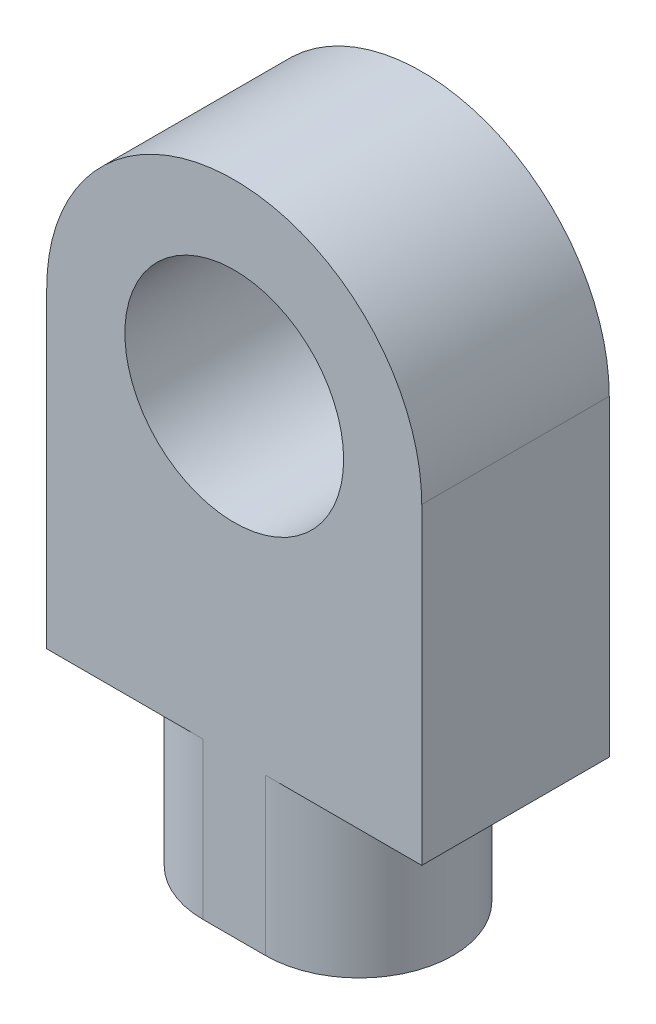
ISO-10303-21;
HEADER;
FILE_DESCRIPTION(('STEP AP214'),'2;1');
FILE_NAME('part.step','',(''),(''),'','','');
FILE_SCHEMA(('AUTOMOTIVE_DESIGN { 1 0 10303 214 1 1 1 1 }'));
ENDSEC;
DATA;
#1=APPLICATION_CONTEXT('core data for automotive mechanical design processes');
#2=APPLICATION_PROTOCOL_DEFINITION('international standard','automotive_design',2000,#1);
#3=PRODUCT_CONTEXT('',#1,'mechanical');
#4=PRODUCT('Part','Part','',(#3));
#5=PRODUCT_RELATED_PRODUCT_CATEGORY('part','',(#4));
#6=PRODUCT_DEFINITION_FORMATION('','',#4);
#7=PRODUCT_DEFINITION_CONTEXT('part definition',#1,'design');
#8=PRODUCT_DEFINITION('design','',#6,#7);
#9=PRODUCT_DEFINITION_SHAPE('','',#8);
#10=(LENGTH_UNIT() NAMED_UNIT(*) SI_UNIT(.MILLI.,.METRE.));
#11=(NAMED_UNIT(*) PLANE_ANGLE_UNIT() SI_UNIT($,.RADIAN.));
#12=(NAMED_UNIT(*) SI_UNIT($,.STERADIAN.) SOLID_ANGLE_UNIT());
#13=UNCERTAINTY_MEASURE_WITH_UNIT(LENGTH_MEASURE(1.E-05),#10,'distance_accuracy_value','');
#14=(GEOMETRIC_REPRESENTATION_CONTEXT(3) GLOBAL_UNCERTAINTY_ASSIGNED_CONTEXT((#13)) GLOBAL_UNIT_ASSIGNED_CONTEXT((#10,
#11,#12)) REPRESENTATION_CONTEXT('',''));
#15=CARTESIAN_POINT('',(0.,0.,0.));
#16=DIRECTION('',(0.,0.,1.));
#17=DIRECTION('',(1.,0.,0.));
#18=AXIS2_PLACEMENT_3D('',#15,#16,#17);
#19=CARTESIAN_POINT('',(-4.,-5.,6.));
#20=DIRECTION('',(0.,1.,0.));
#21=DIRECTION('',(-1.,0.,0.));
#22=AXIS2_PLACEMENT_3D('',#19,#20,#21);
#23=PLANE('',#22);
#24=DIRECTION('',(1.,0.,0.));
#25=VECTOR('',#24,1.);
#26=CARTESIAN_POINT('',(0.,-5.,6.));
#27=LINE('',#26,#25);
#28=CARTESIAN_POINT('',(-0.999999999999998,-5.,6.));
#29=VERTEX_POINT('',#28);
#30=CARTESIAN_POINT('',(0.999999999999999,-5.,6.));
#31=VERTEX_POINT('',#30);
#32=EDGE_CURVE('E37',#29,#31,#27,.T.);
#33=ORIENTED_EDGE('',*,*,#32,.F.);
#34=CARTESIAN_POINT('',(-0.999999999999998,-5.,3.));
#35=DIRECTION('',(0.,1.,0.));
#36=DIRECTION('',(-1.,0.,0.));
#37=AXIS2_PLACEMENT_3D('',#34,#35,#36);
#38=CIRCLE('',#37,3.);
#39=CARTESIAN_POINT('',(-0.999999999999998,-5.,0.));
#40=VERTEX_POINT('',#39);
#41=EDGE_CURVE('E74',#40,#29,#38,.T.);
#42=ORIENTED_EDGE('',*,*,#41,.F.);
#43=DIRECTION('',(-1.,0.,0.));
#44=VECTOR('',#43,1.);
#45=CARTESIAN_POINT('',(-4.,-5.,0.));
#46=LINE('',#45,#44);
#47=CARTESIAN_POINT('',(0.999999999999999,-5.,0.));
#48=VERTEX_POINT('',#47);
#49=EDGE_CURVE('E98',#40,#48,#46,.F.);
#50=ORIENTED_EDGE('',*,*,#49,.T.);
#51=CARTESIAN_POINT('',(0.999999999999999,-5.,3.));
#52=DIRECTION('',(0.,1.,0.));
#53=DIRECTION('',(-1.,0.,0.));
#54=AXIS2_PLACEMENT_3D('',#51,#52,#53);
#55=CIRCLE('',#54,3.);
#56=EDGE_CURVE('E86',#31,#48,#55,.T.);
#57=ORIENTED_EDGE('',*,*,#56,.F.);
#58=EDGE_LOOP('',(#33,#42,#50,#57));
#59=FACE_BOUND('',#58,.T.);
#60=ADVANCED_FACE('F34',(#59),#23,.F.);
#61=CARTESIAN_POINT('',(4.,0.,6.));
#62=DIRECTION('',(0.,1.,0.));
#63=DIRECTION('',(-1.,0.,0.));
#64=AXIS2_PLACEMENT_3D('',#61,#62,#63);
#65=PLANE('',#64);
#66=DIRECTION('',(0.,0.,-1.));
#67=VECTOR('',#66,1.);
#68=CARTESIAN_POINT('',(6.,0.,6.));
#69=LINE('',#68,#67);
#70=CARTESIAN_POINT('',(6.,0.,6.));
#71=VERTEX_POINT('',#70);
#72=CARTESIAN_POINT('',(6.,0.,0.));
#73=VERTEX_POINT('',#72);
#74=EDGE_CURVE('E11',#71,#73,#69,.T.);
#75=ORIENTED_EDGE('',*,*,#74,.F.);
#76=DIRECTION('',(1.,0.,0.));
#77=VECTOR('',#76,1.);
#78=CARTESIAN_POINT('',(4.,0.,6.));
#79=LINE('',#78,#77);
#80=CARTESIAN_POINT('',(0.999999999999998,0.,6.));
#81=VERTEX_POINT('',#80);
#82=EDGE_CURVE('E103',#81,#71,#79,.T.);
#83=ORIENTED_EDGE('',*,*,#82,.F.);
#84=CARTESIAN_POINT('',(0.999999999999998,0.,3.));
#85=DIRECTION('',(0.,1.,0.));
#86=DIRECTION('',(-1.,0.,0.));
#87=AXIS2_PLACEMENT_3D('',#84,#85,#86);
#88=CIRCLE('',#87,3.);
#89=CARTESIAN_POINT('',(0.999999999999999,0.,0.));
#90=VERTEX_POINT('',#89);
#91=EDGE_CURVE('E52',#90,#81,#88,.F.);
#92=ORIENTED_EDGE('',*,*,#91,.F.);
#93=DIRECTION('',(1.,0.,0.));
#94=VECTOR('',#93,1.);
#95=CARTESIAN_POINT('',(4.,0.,0.));
#96=LINE('',#95,#94);
#97=EDGE_CURVE('E126',#90,#73,#96,.T.);
#98=ORIENTED_EDGE('',*,*,#97,.T.);
#99=EDGE_LOOP('',(#75,#83,#92,#98));
#100=FACE_BOUND('',#99,.T.);
#101=ADVANCED_FACE('F199',(#100),#65,.F.);
#102=CARTESIAN_POINT('',(6.,0.,6.));
#103=DIRECTION('',(-1.,0.,0.));
#104=DIRECTION('',(0.,0.,1.));
#105=AXIS2_PLACEMENT_3D('',#102,#103,#104);
#106=PLANE('',#105);
#107=DIRECTION('',(0.,1.,0.));
#108=VECTOR('',#107,1.);
#109=CARTESIAN_POINT('',(6.,0.,0.));
#110=LINE('',#109,#108);
#111=CARTESIAN_POINT('',(6.,10.,0.));
#112=VERTEX_POINT('',#111);
#113=EDGE_CURVE('E128',#73,#112,#110,.T.);
#114=ORIENTED_EDGE('',*,*,#113,.T.);
#115=DIRECTION('',(0.,0.,-1.));
#116=VECTOR('',#115,1.);
#117=CARTESIAN_POINT('',(6.,10.,6.));
#118=LINE('',#117,#116);
#119=CARTESIAN_POINT('',(6.,10.,6.));
#120=VERTEX_POINT('',#119);
#121=EDGE_CURVE('E43',#120,#112,#118,.T.);
#122=ORIENTED_EDGE('',*,*,#121,.F.);
#123=DIRECTION('',(0.,1.,0.));
#124=VECTOR('',#123,1.);
#125=CARTESIAN_POINT('',(6.,0.,6.));
#126=LINE('',#125,#124);
#127=EDGE_CURVE('E105',#71,#120,#126,.T.);
#128=ORIENTED_EDGE('',*,*,#127,.F.);
#129=ORIENTED_EDGE('',*,*,#74,.T.);
#130=EDGE_LOOP('',(#114,#122,#128,#129));
#131=FACE_BOUND('',#130,.T.);
#132=ADVANCED_FACE('F177',(#131),#106,.F.);
#133=CARTESIAN_POINT('',(0.,10.,6.));
#134=DIRECTION('',(0.,0.,-1.));
#135=DIRECTION('',(-1.,0.,0.));
#136=AXIS2_PLACEMENT_3D('',#133,#134,#135);
#137=CYLINDRICAL_SURFACE('',#136,6.);
#138=CARTESIAN_POINT('',(0.,10.,0.));
#139=DIRECTION('',(0.,0.,1.));
#140=DIRECTION('',(1.,0.,0.));
#141=AXIS2_PLACEMENT_3D('',#138,#139,#140);
#142=CIRCLE('',#141,6.);
#143=CARTESIAN_POINT('',(-6.,10.,0.));
#144=VERTEX_POINT('',#143);
#145=EDGE_CURVE('E115',#112,#144,#142,.T.);
#146=ORIENTED_EDGE('',*,*,#145,.T.);
#147=DIRECTION('',(0.,0.,-1.));
#148=VECTOR('',#147,1.);
#149=CARTESIAN_POINT('',(-6.,10.,6.));
#150=LINE('',#149,#148);
#151=CARTESIAN_POINT('',(-6.,10.,6.));
#152=VERTEX_POINT('',#151);
#153=EDGE_CURVE('E121',#152,#144,#150,.T.);
#154=ORIENTED_EDGE('',*,*,#153,.F.);
#155=CARTESIAN_POINT('',(0.,10.,6.));
#156=DIRECTION('',(0.,0.,1.));
#157=DIRECTION('',(1.,0.,0.));
#158=AXIS2_PLACEMENT_3D('',#155,#156,#157);
#159=CIRCLE('',#158,6.);
#160=EDGE_CURVE('E141',#120,#152,#159,.T.);
#161=ORIENTED_EDGE('',*,*,#160,.F.);
#162=ORIENTED_EDGE('',*,*,#121,.T.);
#163=EDGE_LOOP('',(#146,#154,#161,#162));
#164=FACE_BOUND('',#163,.T.);
#165=ADVANCED_FACE('F153',(#164),#137,.T.);
#166=CARTESIAN_POINT('',(-6.,0.,6.));
#167=DIRECTION('',(1.,0.,0.));
#168=DIRECTION('',(0.,0.,-1.));
#169=AXIS2_PLACEMENT_3D('',#166,#167,#168);
#170=PLANE('',#169);
#171=DIRECTION('',(0.,-1.,0.));
#172=VECTOR('',#171,1.);
#173=CARTESIAN_POINT('',(-6.,0.,0.));
#174=LINE('',#173,#172);
#175=CARTESIAN_POINT('',(-6.,0.,0.));
#176=VERTEX_POINT('',#175);
#177=EDGE_CURVE('E108',#144,#176,#174,.T.);
#178=ORIENTED_EDGE('',*,*,#177,.T.);
#179=DIRECTION('',(0.,0.,-1.));
#180=VECTOR('',#179,1.);
#181=CARTESIAN_POINT('',(-6.,0.,6.));
#182=LINE('',#181,#180);
#183=CARTESIAN_POINT('',(-6.,0.,6.));
#184=VERTEX_POINT('',#183);
#185=EDGE_CURVE('E119',#184,#176,#182,.T.);
#186=ORIENTED_EDGE('',*,*,#185,.F.);
#187=DIRECTION('',(0.,-1.,0.));
#188=VECTOR('',#187,1.);
#189=CARTESIAN_POINT('',(-6.,0.,6.));
#190=LINE('',#189,#188);
#191=EDGE_CURVE('E144',#152,#184,#190,.T.);
#192=ORIENTED_EDGE('',*,*,#191,.F.);
#193=ORIENTED_EDGE('',*,*,#153,.T.);
#194=EDGE_LOOP('',(#178,#186,#192,#193));
#195=FACE_BOUND('',#194,.T.);
#196=ADVANCED_FACE('F162',(#195),#170,.F.);
#197=CARTESIAN_POINT('',(-6.,0.,6.));
#198=DIRECTION('',(0.,1.,0.));
#199=DIRECTION('',(-1.,0.,0.));
#200=AXIS2_PLACEMENT_3D('',#197,#198,#199);
#201=PLANE('',#200);
#202=DIRECTION('',(1.,0.,0.));
#203=VECTOR('',#202,1.);
#204=CARTESIAN_POINT('',(-6.,0.,0.));
#205=LINE('',#204,#203);
#206=CARTESIAN_POINT('',(-0.999999999999999,0.,0.));
#207=VERTEX_POINT('',#206);
#208=EDGE_CURVE('E104',#176,#207,#205,.T.);
#209=ORIENTED_EDGE('',*,*,#208,.T.);
#210=CARTESIAN_POINT('',(-0.999999999999999,0.,3.));
#211=DIRECTION('',(0.,1.,0.));
#212=DIRECTION('',(-1.,0.,0.));
#213=AXIS2_PLACEMENT_3D('',#210,#211,#212);
#214=CIRCLE('',#213,3.);
#215=CARTESIAN_POINT('',(-0.999999999999999,0.,6.));
#216=VERTEX_POINT('',#215);
#217=EDGE_CURVE('E180',#216,#207,#214,.F.);
#218=ORIENTED_EDGE('',*,*,#217,.F.);
#219=DIRECTION('',(1.,0.,0.));
#220=VECTOR('',#219,1.);
#221=CARTESIAN_POINT('',(-6.,0.,6.));
#222=LINE('',#221,#220);
#223=EDGE_CURVE('E122',#184,#216,#222,.T.);
#224=ORIENTED_EDGE('',*,*,#223,.F.);
#225=ORIENTED_EDGE('',*,*,#185,.T.);
#226=EDGE_LOOP('',(#209,#218,#224,#225));
#227=FACE_BOUND('',#226,.T.);
#228=ADVANCED_FACE('F188',(#227),#201,.F.);
#229=CARTESIAN_POINT('',(0.,10.,6.));
#230=DIRECTION('',(0.,0.,1.));
#231=DIRECTION('',(1.,0.,0.));
#232=AXIS2_PLACEMENT_3D('',#229,#230,#231);
#233=PLANE('',#232);
#234=DIRECTION('',(0.,-1.,0.));
#235=VECTOR('',#234,1.);
#236=CARTESIAN_POINT('',(0.999999999999996,11.6645501155224,6.));
#237=LINE('',#236,#235);
#238=EDGE_CURVE('E82',#81,#31,#237,.T.);
#239=ORIENTED_EDGE('',*,*,#238,.F.);
#240=ORIENTED_EDGE('',*,*,#82,.T.);
#241=ORIENTED_EDGE('',*,*,#127,.T.);
#242=ORIENTED_EDGE('',*,*,#160,.T.);
#243=ORIENTED_EDGE('',*,*,#191,.T.);
#244=ORIENTED_EDGE('',*,*,#223,.T.);
#245=DIRECTION('',(0.,-1.,0.));
#246=VECTOR('',#245,1.);
#247=CARTESIAN_POINT('',(-1.,11.6645501155224,6.));
#248=LINE('',#247,#246);
#249=EDGE_CURVE('E92',#216,#29,#248,.T.);
#250=ORIENTED_EDGE('',*,*,#249,.T.);
#251=ORIENTED_EDGE('',*,*,#32,.T.);
#252=EDGE_LOOP('',(#239,#240,#241,#242,#243,#244,#250,#251));
#253=FACE_BOUND('',#252,.T.);
#254=CARTESIAN_POINT('',(0.,10.,6.));
#255=DIRECTION('',(0.,0.,1.));
#256=DIRECTION('',(1.,0.,0.));
#257=AXIS2_PLACEMENT_3D('',#254,#255,#256);
#258=CIRCLE('',#257,3.5);
#259=CARTESIAN_POINT('',(3.5,10.,6.));
#260=VERTEX_POINT('',#259);
#261=EDGE_CURVE('E131',#260,#260,#258,.T.);
#262=ORIENTED_EDGE('',*,*,#261,.F.);
#263=EDGE_LOOP('',(#262));
#264=FACE_BOUND('',#263,.T.);
#265=ADVANCED_FACE('F100',(#253,#264),#233,.T.);
#266=CARTESIAN_POINT('',(0.,10.,0.));
#267=DIRECTION('',(0.,0.,1.));
#268=DIRECTION('',(1.,0.,0.));
#269=AXIS2_PLACEMENT_3D('',#266,#267,#268);
#270=PLANE('',#269);
#271=CARTESIAN_POINT('',(0.,10.,0.));
#272=DIRECTION('',(0.,0.,1.));
#273=DIRECTION('',(1.,0.,0.));
#274=AXIS2_PLACEMENT_3D('',#271,#272,#273);
#275=CIRCLE('',#274,3.5);
#276=CARTESIAN_POINT('',(3.5,10.,0.));
#277=VERTEX_POINT('',#276);
#278=EDGE_CURVE('E127',#277,#277,#275,.T.);
#279=ORIENTED_EDGE('',*,*,#278,.T.);
#280=EDGE_LOOP('',(#279));
#281=FACE_BOUND('',#280,.T.);
#282=ORIENTED_EDGE('',*,*,#97,.F.);
#283=DIRECTION('',(0.,-1.,0.));
#284=VECTOR('',#283,1.);
#285=CARTESIAN_POINT('',(0.999999999999995,11.6645501155224,0.));
#286=LINE('',#285,#284);
#287=EDGE_CURVE('E91',#90,#48,#286,.T.);
#288=ORIENTED_EDGE('',*,*,#287,.T.);
#289=ORIENTED_EDGE('',*,*,#49,.F.);
#290=DIRECTION('',(0.,-1.,0.));
#291=VECTOR('',#290,1.);
#292=CARTESIAN_POINT('',(-1.,11.6645501155224,0.));
#293=LINE('',#292,#291);
#294=EDGE_CURVE('E166',#207,#40,#293,.T.);
#295=ORIENTED_EDGE('',*,*,#294,.F.);
#296=ORIENTED_EDGE('',*,*,#208,.F.);
#297=ORIENTED_EDGE('',*,*,#177,.F.);
#298=ORIENTED_EDGE('',*,*,#145,.F.);
#299=ORIENTED_EDGE('',*,*,#113,.F.);
#300=EDGE_LOOP('',(#282,#288,#289,#295,#296,#297,#298,#299));
#301=FACE_BOUND('',#300,.T.);
#302=ADVANCED_FACE('F164',(#281,#301),#270,.F.);
#303=CARTESIAN_POINT('',(0.,10.,6.));
#304=DIRECTION('',(0.,0.,1.));
#305=DIRECTION('',(1.,0.,0.));
#306=AXIS2_PLACEMENT_3D('',#303,#304,#305);
#307=CYLINDRICAL_SURFACE('',#306,3.5);
#308=ORIENTED_EDGE('',*,*,#261,.T.);
#309=EDGE_LOOP('',(#308));
#310=FACE_BOUND('',#309,.T.);
#311=ORIENTED_EDGE('',*,*,#278,.F.);
#312=EDGE_LOOP('',(#311));
#313=FACE_BOUND('',#312,.T.);
#314=ADVANCED_FACE('F223',(#310,#313),#307,.F.);
#315=CARTESIAN_POINT('',(-1.,11.6645501155224,3.));
#316=DIRECTION('',(0.,-1.,0.));
#317=DIRECTION('',(1.,0.,0.));
#318=AXIS2_PLACEMENT_3D('',#315,#316,#317);
#319=CYLINDRICAL_SURFACE('',#318,3.);
#320=ORIENTED_EDGE('',*,*,#249,.F.);
#321=ORIENTED_EDGE('',*,*,#217,.T.);
#322=ORIENTED_EDGE('',*,*,#294,.T.);
#323=ORIENTED_EDGE('',*,*,#41,.T.);
#324=EDGE_LOOP('',(#320,#321,#322,#323));
#325=FACE_BOUND('',#324,.T.);
#326=ADVANCED_FACE('F185',(#325),#319,.T.);
#327=CARTESIAN_POINT('',(0.999999999999995,11.6645501155224,3.));
#328=DIRECTION('',(0.,-1.,0.));
#329=DIRECTION('',(1.,0.,0.));
#330=AXIS2_PLACEMENT_3D('',#327,#328,#329);
#331=CYLINDRICAL_SURFACE('',#330,3.);
#332=ORIENTED_EDGE('',*,*,#56,.T.);
#333=ORIENTED_EDGE('',*,*,#287,.F.);
#334=ORIENTED_EDGE('',*,*,#91,.T.);
#335=ORIENTED_EDGE('',*,*,#238,.T.);
#336=EDGE_LOOP('',(#332,#333,#334,#335));
#337=FACE_BOUND('',#336,.T.);
#338=ADVANCED_FACE('F84',(#337),#331,.T.);
#339=CLOSED_SHELL('',(#60,#101,#132,#165,#196,#228,#265,#302,#314,#326,#338));
#340=MANIFOLD_SOLID_BREP('B2',#339);
#341=ADVANCED_BREP_SHAPE_REPRESENTATION('',(#18,#340),#14);
#342=SHAPE_DEFINITION_REPRESENTATION(#9,#341);
ENDSEC;
END-ISO-10303-21;
